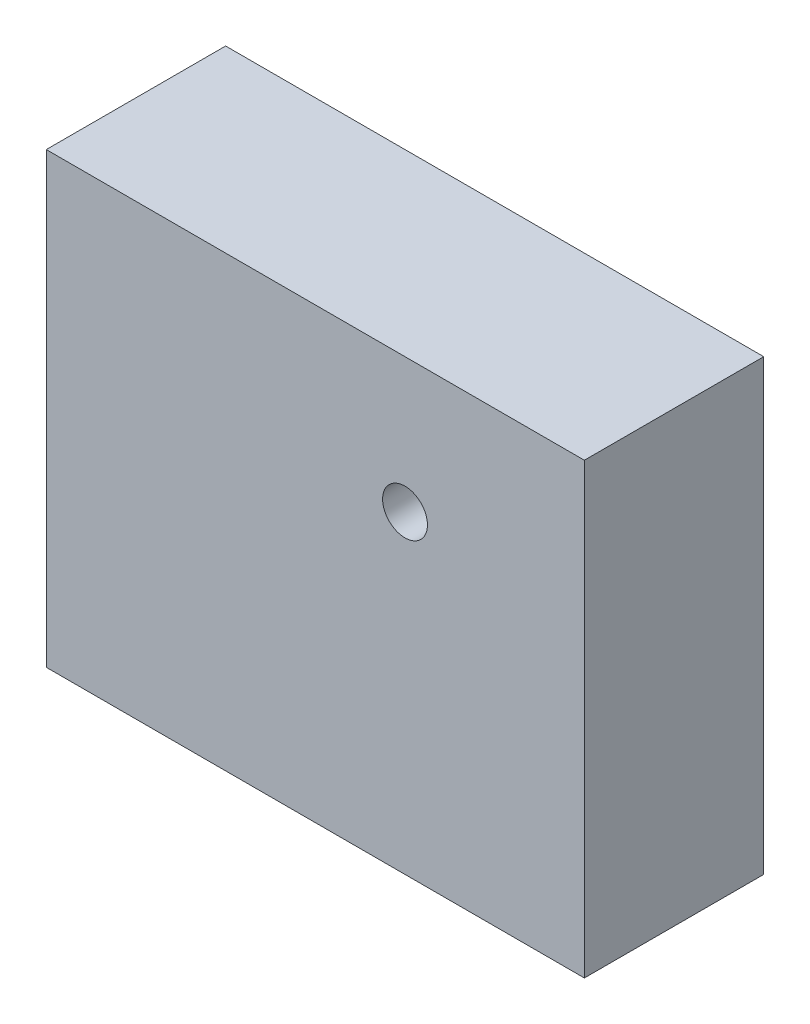
ISO-10303-21;
HEADER;
FILE_DESCRIPTION(('STEP AP214'),'2;1');
FILE_NAME('part.step','',(''),(''),'','','');
FILE_SCHEMA(('AUTOMOTIVE_DESIGN { 1 0 10303 214 1 1 1 1 }'));
ENDSEC;
DATA;
#1=APPLICATION_CONTEXT('core data for automotive mechanical design processes');
#2=APPLICATION_PROTOCOL_DEFINITION('international standard','automotive_design',2000,#1);
#3=PRODUCT_CONTEXT('',#1,'mechanical');
#4=PRODUCT('Part','Part','',(#3));
#5=PRODUCT_RELATED_PRODUCT_CATEGORY('part','',(#4));
#6=PRODUCT_DEFINITION_FORMATION('','',#4);
#7=PRODUCT_DEFINITION_CONTEXT('part definition',#1,'design');
#8=PRODUCT_DEFINITION('design','',#6,#7);
#9=PRODUCT_DEFINITION_SHAPE('','',#8);
#10=(LENGTH_UNIT() NAMED_UNIT(*) SI_UNIT(.MILLI.,.METRE.));
#11=(NAMED_UNIT(*) PLANE_ANGLE_UNIT() SI_UNIT($,.RADIAN.));
#12=(NAMED_UNIT(*) SI_UNIT($,.STERADIAN.) SOLID_ANGLE_UNIT());
#13=UNCERTAINTY_MEASURE_WITH_UNIT(LENGTH_MEASURE(1.E-05),#10,'distance_accuracy_value','');
#14=(GEOMETRIC_REPRESENTATION_CONTEXT(3) GLOBAL_UNCERTAINTY_ASSIGNED_CONTEXT((#13)) GLOBAL_UNIT_ASSIGNED_CONTEXT((#10,
#11,#12)) REPRESENTATION_CONTEXT('',''));
#15=CARTESIAN_POINT('',(0.,0.,0.));
#16=DIRECTION('',(0.,0.,1.));
#17=DIRECTION('',(1.,0.,0.));
#18=AXIS2_PLACEMENT_3D('',#15,#16,#17);
#19=CARTESIAN_POINT('',(-30.,-25.,20.));
#20=DIRECTION('',(1.,0.,0.));
#21=DIRECTION('',(0.,0.,-1.));
#22=AXIS2_PLACEMENT_3D('',#19,#20,#21);
#23=PLANE('',#22);
#24=DIRECTION('',(0.,-1.,0.));
#25=VECTOR('',#24,1.);
#26=CARTESIAN_POINT('',(-30.,-25.,0.));
#27=LINE('',#26,#25);
#28=CARTESIAN_POINT('',(-30.,25.,0.));
#29=VERTEX_POINT('',#28);
#30=CARTESIAN_POINT('',(-30.,-25.,0.));
#31=VERTEX_POINT('',#30);
#32=EDGE_CURVE('E106',#29,#31,#27,.T.);
#33=ORIENTED_EDGE('',*,*,#32,.T.);
#34=DIRECTION('',(0.,0.,-1.));
#35=VECTOR('',#34,1.);
#36=CARTESIAN_POINT('',(-30.,-25.,20.));
#37=LINE('',#36,#35);
#38=CARTESIAN_POINT('',(-30.,-25.,20.));
#39=VERTEX_POINT('',#38);
#40=EDGE_CURVE('E11',#39,#31,#37,.T.);
#41=ORIENTED_EDGE('',*,*,#40,.F.);
#42=DIRECTION('',(0.,-1.,0.));
#43=VECTOR('',#42,1.);
#44=CARTESIAN_POINT('',(-30.,-25.,20.));
#45=LINE('',#44,#43);
#46=CARTESIAN_POINT('',(-30.,25.,20.));
#47=VERTEX_POINT('',#46);
#48=EDGE_CURVE('E94',#47,#39,#45,.T.);
#49=ORIENTED_EDGE('',*,*,#48,.F.);
#50=DIRECTION('',(0.,0.,-1.));
#51=VECTOR('',#50,1.);
#52=CARTESIAN_POINT('',(-30.,25.,20.));
#53=LINE('',#52,#51);
#54=EDGE_CURVE('E102',#47,#29,#53,.T.);
#55=ORIENTED_EDGE('',*,*,#54,.T.);
#56=EDGE_LOOP('',(#33,#41,#49,#55));
#57=FACE_BOUND('',#56,.T.);
#58=ADVANCED_FACE('F43',(#57),#23,.F.);
#59=CARTESIAN_POINT('',(-30.,-25.,20.));
#60=DIRECTION('',(0.,1.,0.));
#61=DIRECTION('',(0.,0.,1.));
#62=AXIS2_PLACEMENT_3D('',#59,#60,#61);
#63=PLANE('',#62);
#64=DIRECTION('',(1.,0.,0.));
#65=VECTOR('',#64,1.);
#66=CARTESIAN_POINT('',(-30.,-25.,0.));
#67=LINE('',#66,#65);
#68=CARTESIAN_POINT('',(30.,-25.,0.));
#69=VERTEX_POINT('',#68);
#70=EDGE_CURVE('E98',#31,#69,#67,.T.);
#71=ORIENTED_EDGE('',*,*,#70,.T.);
#72=DIRECTION('',(0.,0.,-1.));
#73=VECTOR('',#72,1.);
#74=CARTESIAN_POINT('',(30.,-25.,20.));
#75=LINE('',#74,#73);
#76=CARTESIAN_POINT('',(30.,-25.,20.));
#77=VERTEX_POINT('',#76);
#78=EDGE_CURVE('E51',#77,#69,#75,.T.);
#79=ORIENTED_EDGE('',*,*,#78,.F.);
#80=DIRECTION('',(1.,0.,0.));
#81=VECTOR('',#80,1.);
#82=CARTESIAN_POINT('',(-30.,-25.,20.));
#83=LINE('',#82,#81);
#84=EDGE_CURVE('E89',#39,#77,#83,.T.);
#85=ORIENTED_EDGE('',*,*,#84,.F.);
#86=ORIENTED_EDGE('',*,*,#40,.T.);
#87=EDGE_LOOP('',(#71,#79,#85,#86));
#88=FACE_BOUND('',#87,.T.);
#89=ADVANCED_FACE('F97',(#88),#63,.F.);
#90=CARTESIAN_POINT('',(30.,-25.,20.));
#91=DIRECTION('',(-1.,0.,0.));
#92=DIRECTION('',(0.,0.,1.));
#93=AXIS2_PLACEMENT_3D('',#90,#91,#92);
#94=PLANE('',#93);
#95=DIRECTION('',(0.,1.,0.));
#96=VECTOR('',#95,1.);
#97=CARTESIAN_POINT('',(30.,-25.,0.));
#98=LINE('',#97,#96);
#99=CARTESIAN_POINT('',(30.,25.,0.));
#100=VERTEX_POINT('',#99);
#101=EDGE_CURVE('E76',#69,#100,#98,.T.);
#102=ORIENTED_EDGE('',*,*,#101,.T.);
#103=DIRECTION('',(0.,0.,-1.));
#104=VECTOR('',#103,1.);
#105=CARTESIAN_POINT('',(30.,25.,20.));
#106=LINE('',#105,#104);
#107=CARTESIAN_POINT('',(30.,25.,20.));
#108=VERTEX_POINT('',#107);
#109=EDGE_CURVE('E99',#108,#100,#106,.T.);
#110=ORIENTED_EDGE('',*,*,#109,.F.);
#111=DIRECTION('',(0.,1.,0.));
#112=VECTOR('',#111,1.);
#113=CARTESIAN_POINT('',(30.,-25.,20.));
#114=LINE('',#113,#112);
#115=EDGE_CURVE('E92',#77,#108,#114,.T.);
#116=ORIENTED_EDGE('',*,*,#115,.F.);
#117=ORIENTED_EDGE('',*,*,#78,.T.);
#118=EDGE_LOOP('',(#102,#110,#116,#117));
#119=FACE_BOUND('',#118,.T.);
#120=ADVANCED_FACE('F100',(#119),#94,.F.);
#121=CARTESIAN_POINT('',(-30.,25.,20.));
#122=DIRECTION('',(0.,-1.,0.));
#123=DIRECTION('',(0.,0.,-1.));
#124=AXIS2_PLACEMENT_3D('',#121,#122,#123);
#125=PLANE('',#124);
#126=DIRECTION('',(-1.,0.,0.));
#127=VECTOR('',#126,1.);
#128=CARTESIAN_POINT('',(-30.,25.,0.));
#129=LINE('',#128,#127);
#130=EDGE_CURVE('E82',#100,#29,#129,.T.);
#131=ORIENTED_EDGE('',*,*,#130,.T.);
#132=ORIENTED_EDGE('',*,*,#54,.F.);
#133=DIRECTION('',(-1.,0.,0.));
#134=VECTOR('',#133,1.);
#135=CARTESIAN_POINT('',(-30.,25.,20.));
#136=LINE('',#135,#134);
#137=EDGE_CURVE('E59',#108,#47,#136,.T.);
#138=ORIENTED_EDGE('',*,*,#137,.F.);
#139=ORIENTED_EDGE('',*,*,#109,.T.);
#140=EDGE_LOOP('',(#131,#132,#138,#139));
#141=FACE_BOUND('',#140,.T.);
#142=ADVANCED_FACE('F114',(#141),#125,.F.);
#143=CARTESIAN_POINT('',(0.,0.,20.));
#144=DIRECTION('',(0.,0.,-1.));
#145=DIRECTION('',(-1.,0.,0.));
#146=AXIS2_PLACEMENT_3D('',#143,#144,#145);
#147=PLANE('',#146);
#148=CARTESIAN_POINT('',(10.,10.,20.));
#149=DIRECTION('',(0.,0.,1.));
#150=DIRECTION('',(1.,0.,0.));
#151=AXIS2_PLACEMENT_3D('',#148,#149,#150);
#152=CIRCLE('',#151,2.5);
#153=CARTESIAN_POINT('',(12.5,10.,20.));
#154=VERTEX_POINT('',#153);
#155=EDGE_CURVE('E120',#154,#154,#152,.T.);
#156=ORIENTED_EDGE('',*,*,#155,.F.);
#157=EDGE_LOOP('',(#156));
#158=FACE_BOUND('',#157,.T.);
#159=ORIENTED_EDGE('',*,*,#48,.T.);
#160=ORIENTED_EDGE('',*,*,#84,.T.);
#161=ORIENTED_EDGE('',*,*,#115,.T.);
#162=ORIENTED_EDGE('',*,*,#137,.T.);
#163=EDGE_LOOP('',(#159,#160,#161,#162));
#164=FACE_BOUND('',#163,.T.);
#165=ADVANCED_FACE('F90',(#158,#164),#147,.F.);
#166=CARTESIAN_POINT('',(0.,0.,0.));
#167=DIRECTION('',(0.,0.,-1.));
#168=DIRECTION('',(-1.,0.,0.));
#169=AXIS2_PLACEMENT_3D('',#166,#167,#168);
#170=PLANE('',#169);
#171=ORIENTED_EDGE('',*,*,#32,.F.);
#172=ORIENTED_EDGE('',*,*,#130,.F.);
#173=ORIENTED_EDGE('',*,*,#101,.F.);
#174=ORIENTED_EDGE('',*,*,#70,.F.);
#175=EDGE_LOOP('',(#171,#172,#173,#174));
#176=FACE_BOUND('',#175,.T.);
#177=ADVANCED_FACE('F117',(#176),#170,.T.);
#178=CARTESIAN_POINT('',(10.,10.,8.));
#179=DIRECTION('',(0.,0.,1.));
#180=DIRECTION('',(1.,0.,0.));
#181=AXIS2_PLACEMENT_3D('',#178,#179,#180);
#182=CYLINDRICAL_SURFACE('',#181,2.5);
#183=CARTESIAN_POINT('',(10.,10.,8.));
#184=DIRECTION('',(0.,0.,1.));
#185=DIRECTION('',(1.,0.,0.));
#186=AXIS2_PLACEMENT_3D('',#183,#184,#185);
#187=CIRCLE('',#186,2.5);
#188=CARTESIAN_POINT('',(12.5,10.,8.));
#189=VERTEX_POINT('',#188);
#190=EDGE_CURVE('E109',#189,#189,#187,.T.);
#191=ORIENTED_EDGE('',*,*,#190,.F.);
#192=EDGE_LOOP('',(#191));
#193=FACE_BOUND('',#192,.T.);
#194=ORIENTED_EDGE('',*,*,#155,.T.);
#195=EDGE_LOOP('',(#194));
#196=FACE_BOUND('',#195,.T.);
#197=ADVANCED_FACE('F128',(#193,#196),#182,.F.);
#198=CARTESIAN_POINT('',(10.,10.,8.));
#199=DIRECTION('',(0.,0.,1.));
#200=DIRECTION('',(1.,0.,0.));
#201=AXIS2_PLACEMENT_3D('',#198,#199,#200);
#202=PLANE('',#201);
#203=ORIENTED_EDGE('',*,*,#190,.T.);
#204=EDGE_LOOP('',(#203));
#205=FACE_BOUND('',#204,.T.);
#206=ADVANCED_FACE('F126',(#205),#202,.T.);
#207=CLOSED_SHELL('',(#58,#89,#120,#142,#165,#177,#197,#206));
#208=MANIFOLD_SOLID_BREP('B2',#207);
#209=ADVANCED_BREP_SHAPE_REPRESENTATION('',(#18,#208),#14);
#210=SHAPE_DEFINITION_REPRESENTATION(#9,#209);
ENDSEC;
END-ISO-10303-21;
